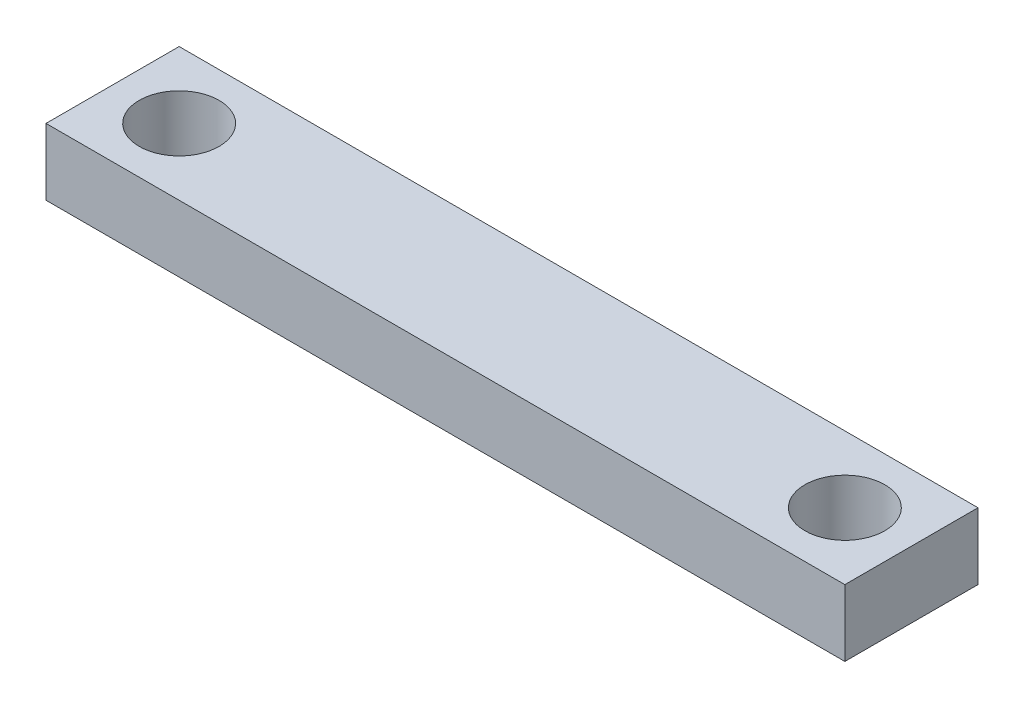
ISO-10303-21;
HEADER;
FILE_DESCRIPTION(('STEP AP214'),'2;1');
FILE_NAME('part.step','',(''),(''),'','','');
FILE_SCHEMA(('AUTOMOTIVE_DESIGN { 1 0 10303 214 1 1 1 1 }'));
ENDSEC;
DATA;
#1=APPLICATION_CONTEXT('core data for automotive mechanical design processes');
#2=APPLICATION_PROTOCOL_DEFINITION('international standard','automotive_design',2000,#1);
#3=PRODUCT_CONTEXT('',#1,'mechanical');
#4=PRODUCT('Part','Part','',(#3));
#5=PRODUCT_RELATED_PRODUCT_CATEGORY('part','',(#4));
#6=PRODUCT_DEFINITION_FORMATION('','',#4);
#7=PRODUCT_DEFINITION_CONTEXT('part definition',#1,'design');
#8=PRODUCT_DEFINITION('design','',#6,#7);
#9=PRODUCT_DEFINITION_SHAPE('','',#8);
#10=(LENGTH_UNIT() NAMED_UNIT(*) SI_UNIT(.MILLI.,.METRE.));
#11=(NAMED_UNIT(*) PLANE_ANGLE_UNIT() SI_UNIT($,.RADIAN.));
#12=(NAMED_UNIT(*) SI_UNIT($,.STERADIAN.) SOLID_ANGLE_UNIT());
#13=UNCERTAINTY_MEASURE_WITH_UNIT(LENGTH_MEASURE(1.E-05),#10,'distance_accuracy_value','');
#14=(GEOMETRIC_REPRESENTATION_CONTEXT(3) GLOBAL_UNCERTAINTY_ASSIGNED_CONTEXT((#13)) GLOBAL_UNIT_ASSIGNED_CONTEXT((#10,
#11,#12)) REPRESENTATION_CONTEXT('',''));
#15=CARTESIAN_POINT('',(0.,0.,0.));
#16=DIRECTION('',(0.,0.,1.));
#17=DIRECTION('',(1.,0.,0.));
#18=AXIS2_PLACEMENT_3D('',#15,#16,#17);
#19=CARTESIAN_POINT('',(0.,2.5,0.));
#20=DIRECTION('',(0.,-1.,0.));
#21=DIRECTION('',(0.,0.,-1.));
#22=AXIS2_PLACEMENT_3D('',#19,#20,#21);
#23=PLANE('',#22);
#24=DIRECTION('',(0.,0.,1.));
#25=VECTOR('',#24,1.);
#26=CARTESIAN_POINT('',(-30.,2.5,-5.));
#27=LINE('',#26,#25);
#28=CARTESIAN_POINT('',(-30.,2.5,-5.));
#29=VERTEX_POINT('',#28);
#30=CARTESIAN_POINT('',(-30.,2.5,5.));
#31=VERTEX_POINT('',#30);
#32=EDGE_CURVE('E85',#29,#31,#27,.T.);
#33=ORIENTED_EDGE('',*,*,#32,.T.);
#34=DIRECTION('',(1.,0.,0.));
#35=VECTOR('',#34,1.);
#36=CARTESIAN_POINT('',(30.,2.5,4.99999999999999));
#37=LINE('',#36,#35);
#38=CARTESIAN_POINT('',(30.,2.5,4.99999999999999));
#39=VERTEX_POINT('',#38);
#40=EDGE_CURVE('E80',#31,#39,#37,.T.);
#41=ORIENTED_EDGE('',*,*,#40,.T.);
#42=DIRECTION('',(0.,0.,-1.));
#43=VECTOR('',#42,1.);
#44=CARTESIAN_POINT('',(30.,2.5,-5.00000000000001));
#45=LINE('',#44,#43);
#46=CARTESIAN_POINT('',(30.,2.5,-5.00000000000001));
#47=VERTEX_POINT('',#46);
#48=EDGE_CURVE('E83',#39,#47,#45,.T.);
#49=ORIENTED_EDGE('',*,*,#48,.T.);
#50=DIRECTION('',(-1.,0.,0.));
#51=VECTOR('',#50,1.);
#52=CARTESIAN_POINT('',(30.,2.5,-5.00000000000001));
#53=LINE('',#52,#51);
#54=EDGE_CURVE('E50',#47,#29,#53,.T.);
#55=ORIENTED_EDGE('',*,*,#54,.T.);
#56=EDGE_LOOP('',(#33,#41,#49,#55));
#57=FACE_BOUND('',#56,.T.);
#58=CARTESIAN_POINT('',(-25.,2.5,0.));
#59=DIRECTION('',(0.,1.,0.));
#60=DIRECTION('',(0.,0.,1.));
#61=AXIS2_PLACEMENT_3D('',#58,#59,#60);
#62=CIRCLE('',#61,2.99999999999999);
#63=CARTESIAN_POINT('',(-25.,2.5,2.99999999999999));
#64=VERTEX_POINT('',#63);
#65=EDGE_CURVE('E100',#64,#64,#62,.T.);
#66=ORIENTED_EDGE('',*,*,#65,.F.);
#67=EDGE_LOOP('',(#66));
#68=FACE_BOUND('',#67,.T.);
#69=CARTESIAN_POINT('',(25.,2.5,0.));
#70=DIRECTION('',(0.,1.,0.));
#71=DIRECTION('',(0.,0.,1.));
#72=AXIS2_PLACEMENT_3D('',#69,#70,#71);
#73=CIRCLE('',#72,2.99999999999999);
#74=CARTESIAN_POINT('',(25.,2.5,2.99999999999998));
#75=VERTEX_POINT('',#74);
#76=EDGE_CURVE('E115',#75,#75,#73,.T.);
#77=ORIENTED_EDGE('',*,*,#76,.F.);
#78=EDGE_LOOP('',(#77));
#79=FACE_BOUND('',#78,.T.);
#80=ADVANCED_FACE('F33',(#57,#68,#79),#23,.F.);
#81=CARTESIAN_POINT('',(0.,-2.5,0.));
#82=DIRECTION('',(0.,-1.,0.));
#83=DIRECTION('',(0.,0.,-1.));
#84=AXIS2_PLACEMENT_3D('',#81,#82,#83);
#85=PLANE('',#84);
#86=CARTESIAN_POINT('',(-25.,-2.5,0.));
#87=DIRECTION('',(0.,1.,0.));
#88=DIRECTION('',(0.,0.,1.));
#89=AXIS2_PLACEMENT_3D('',#86,#87,#88);
#90=CIRCLE('',#89,2.99999999999999);
#91=CARTESIAN_POINT('',(-25.,-2.5,2.99999999999999));
#92=VERTEX_POINT('',#91);
#93=EDGE_CURVE('E112',#92,#92,#90,.T.);
#94=ORIENTED_EDGE('',*,*,#93,.T.);
#95=EDGE_LOOP('',(#94));
#96=FACE_BOUND('',#95,.T.);
#97=DIRECTION('',(0.,0.,1.));
#98=VECTOR('',#97,1.);
#99=CARTESIAN_POINT('',(-30.,-2.5,-5.));
#100=LINE('',#99,#98);
#101=CARTESIAN_POINT('',(-30.,-2.5,-5.));
#102=VERTEX_POINT('',#101);
#103=CARTESIAN_POINT('',(-30.,-2.5,5.));
#104=VERTEX_POINT('',#103);
#105=EDGE_CURVE('E97',#102,#104,#100,.T.);
#106=ORIENTED_EDGE('',*,*,#105,.F.);
#107=DIRECTION('',(-1.,0.,0.));
#108=VECTOR('',#107,1.);
#109=CARTESIAN_POINT('',(30.,-2.5,-5.00000000000001));
#110=LINE('',#109,#108);
#111=CARTESIAN_POINT('',(30.,-2.5,-5.00000000000001));
#112=VERTEX_POINT('',#111);
#113=EDGE_CURVE('E73',#112,#102,#110,.T.);
#114=ORIENTED_EDGE('',*,*,#113,.F.);
#115=DIRECTION('',(0.,0.,-1.));
#116=VECTOR('',#115,1.);
#117=CARTESIAN_POINT('',(30.,-2.5,-5.00000000000001));
#118=LINE('',#117,#116);
#119=CARTESIAN_POINT('',(30.,-2.5,4.99999999999999));
#120=VERTEX_POINT('',#119);
#121=EDGE_CURVE('E67',#120,#112,#118,.T.);
#122=ORIENTED_EDGE('',*,*,#121,.F.);
#123=DIRECTION('',(1.,0.,0.));
#124=VECTOR('',#123,1.);
#125=CARTESIAN_POINT('',(30.,-2.5,4.99999999999999));
#126=LINE('',#125,#124);
#127=EDGE_CURVE('E89',#104,#120,#126,.T.);
#128=ORIENTED_EDGE('',*,*,#127,.F.);
#129=EDGE_LOOP('',(#106,#114,#122,#128));
#130=FACE_BOUND('',#129,.T.);
#131=CARTESIAN_POINT('',(25.,-2.5,0.));
#132=DIRECTION('',(0.,1.,0.));
#133=DIRECTION('',(0.,0.,1.));
#134=AXIS2_PLACEMENT_3D('',#131,#132,#133);
#135=CIRCLE('',#134,2.99999999999999);
#136=CARTESIAN_POINT('',(25.,-2.5,2.99999999999998));
#137=VERTEX_POINT('',#136);
#138=EDGE_CURVE('E118',#137,#137,#135,.T.);
#139=ORIENTED_EDGE('',*,*,#138,.T.);
#140=EDGE_LOOP('',(#139));
#141=FACE_BOUND('',#140,.T.);
#142=ADVANCED_FACE('F108',(#96,#130,#141),#85,.T.);
#143=CARTESIAN_POINT('',(-30.,2.5,-5.));
#144=DIRECTION('',(1.,0.,0.));
#145=DIRECTION('',(0.,0.,-1.));
#146=AXIS2_PLACEMENT_3D('',#143,#144,#145);
#147=PLANE('',#146);
#148=ORIENTED_EDGE('',*,*,#105,.T.);
#149=DIRECTION('',(0.,-1.,0.));
#150=VECTOR('',#149,1.);
#151=CARTESIAN_POINT('',(-30.,2.5,5.));
#152=LINE('',#151,#150);
#153=EDGE_CURVE('E11',#31,#104,#152,.T.);
#154=ORIENTED_EDGE('',*,*,#153,.F.);
#155=ORIENTED_EDGE('',*,*,#32,.F.);
#156=DIRECTION('',(0.,-1.,0.));
#157=VECTOR('',#156,1.);
#158=CARTESIAN_POINT('',(-30.,2.5,-5.));
#159=LINE('',#158,#157);
#160=EDGE_CURVE('E93',#29,#102,#159,.T.);
#161=ORIENTED_EDGE('',*,*,#160,.T.);
#162=EDGE_LOOP('',(#148,#154,#155,#161));
#163=FACE_BOUND('',#162,.T.);
#164=ADVANCED_FACE('F35',(#163),#147,.F.);
#165=CARTESIAN_POINT('',(30.,2.5,4.99999999999999));
#166=DIRECTION('',(0.,0.,-1.));
#167=DIRECTION('',(-1.,0.,0.));
#168=AXIS2_PLACEMENT_3D('',#165,#166,#167);
#169=PLANE('',#168);
#170=ORIENTED_EDGE('',*,*,#127,.T.);
#171=DIRECTION('',(0.,-1.,0.));
#172=VECTOR('',#171,1.);
#173=CARTESIAN_POINT('',(30.,2.5,4.99999999999999));
#174=LINE('',#173,#172);
#175=EDGE_CURVE('E42',#39,#120,#174,.T.);
#176=ORIENTED_EDGE('',*,*,#175,.F.);
#177=ORIENTED_EDGE('',*,*,#40,.F.);
#178=ORIENTED_EDGE('',*,*,#153,.T.);
#179=EDGE_LOOP('',(#170,#176,#177,#178));
#180=FACE_BOUND('',#179,.T.);
#181=ADVANCED_FACE('F88',(#180),#169,.F.);
#182=CARTESIAN_POINT('',(30.,2.5,-5.00000000000001));
#183=DIRECTION('',(-1.,0.,0.));
#184=DIRECTION('',(0.,0.,1.));
#185=AXIS2_PLACEMENT_3D('',#182,#183,#184);
#186=PLANE('',#185);
#187=ORIENTED_EDGE('',*,*,#121,.T.);
#188=DIRECTION('',(0.,-1.,0.));
#189=VECTOR('',#188,1.);
#190=CARTESIAN_POINT('',(30.,2.5,-5.00000000000001));
#191=LINE('',#190,#189);
#192=EDGE_CURVE('E90',#47,#112,#191,.T.);
#193=ORIENTED_EDGE('',*,*,#192,.F.);
#194=ORIENTED_EDGE('',*,*,#48,.F.);
#195=ORIENTED_EDGE('',*,*,#175,.T.);
#196=EDGE_LOOP('',(#187,#193,#194,#195));
#197=FACE_BOUND('',#196,.T.);
#198=ADVANCED_FACE('F91',(#197),#186,.F.);
#199=CARTESIAN_POINT('',(30.,2.5,-5.00000000000001));
#200=DIRECTION('',(0.,0.,1.));
#201=DIRECTION('',(1.,0.,0.));
#202=AXIS2_PLACEMENT_3D('',#199,#200,#201);
#203=PLANE('',#202);
#204=ORIENTED_EDGE('',*,*,#113,.T.);
#205=ORIENTED_EDGE('',*,*,#160,.F.);
#206=ORIENTED_EDGE('',*,*,#54,.F.);
#207=ORIENTED_EDGE('',*,*,#192,.T.);
#208=EDGE_LOOP('',(#204,#205,#206,#207));
#209=FACE_BOUND('',#208,.T.);
#210=ADVANCED_FACE('F105',(#209),#203,.F.);
#211=CARTESIAN_POINT('',(-25.,2.5,0.));
#212=DIRECTION('',(0.,-1.,0.));
#213=DIRECTION('',(0.,0.,-1.));
#214=AXIS2_PLACEMENT_3D('',#211,#212,#213);
#215=CYLINDRICAL_SURFACE('',#214,2.99999999999999);
#216=ORIENTED_EDGE('',*,*,#65,.T.);
#217=EDGE_LOOP('',(#216));
#218=FACE_BOUND('',#217,.T.);
#219=ORIENTED_EDGE('',*,*,#93,.F.);
#220=EDGE_LOOP('',(#219));
#221=FACE_BOUND('',#220,.T.);
#222=ADVANCED_FACE('F135',(#218,#221),#215,.F.);
#223=CARTESIAN_POINT('',(25.,2.5,0.));
#224=DIRECTION('',(0.,-1.,0.));
#225=DIRECTION('',(0.,0.,-1.));
#226=AXIS2_PLACEMENT_3D('',#223,#224,#225);
#227=CYLINDRICAL_SURFACE('',#226,2.99999999999999);
#228=ORIENTED_EDGE('',*,*,#76,.T.);
#229=EDGE_LOOP('',(#228));
#230=FACE_BOUND('',#229,.T.);
#231=ORIENTED_EDGE('',*,*,#138,.F.);
#232=EDGE_LOOP('',(#231));
#233=FACE_BOUND('',#232,.T.);
#234=ADVANCED_FACE('F124',(#230,#233),#227,.F.);
#235=CLOSED_SHELL('',(#80,#142,#164,#181,#198,#210,#222,#234));
#236=MANIFOLD_SOLID_BREP('B2',#235);
#237=ADVANCED_BREP_SHAPE_REPRESENTATION('',(#18,#236),#14);
#238=SHAPE_DEFINITION_REPRESENTATION(#9,#237);
ENDSEC;
END-ISO-10303-21;
